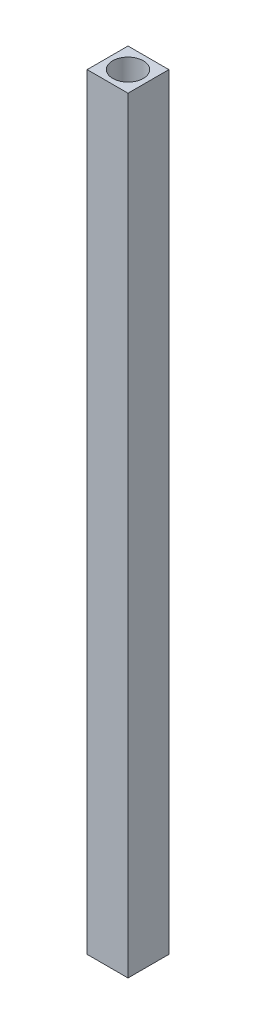
ISO-10303-21;
HEADER;
FILE_DESCRIPTION(('STEP AP214'),'2;1');
FILE_NAME('part.step','',(''),(''),'','','');
FILE_SCHEMA(('AUTOMOTIVE_DESIGN { 1 0 10303 214 1 1 1 1 }'));
ENDSEC;
DATA;
#1=APPLICATION_CONTEXT('core data for automotive mechanical design processes');
#2=APPLICATION_PROTOCOL_DEFINITION('international standard','automotive_design',2000,#1);
#3=PRODUCT_CONTEXT('',#1,'mechanical');
#4=PRODUCT('Part','Part','',(#3));
#5=PRODUCT_RELATED_PRODUCT_CATEGORY('part','',(#4));
#6=PRODUCT_DEFINITION_FORMATION('','',#4);
#7=PRODUCT_DEFINITION_CONTEXT('part definition',#1,'design');
#8=PRODUCT_DEFINITION('design','',#6,#7);
#9=PRODUCT_DEFINITION_SHAPE('','',#8);
#10=(LENGTH_UNIT() NAMED_UNIT(*) SI_UNIT(.MILLI.,.METRE.));
#11=(NAMED_UNIT(*) PLANE_ANGLE_UNIT() SI_UNIT($,.RADIAN.));
#12=(NAMED_UNIT(*) SI_UNIT($,.STERADIAN.) SOLID_ANGLE_UNIT());
#13=UNCERTAINTY_MEASURE_WITH_UNIT(LENGTH_MEASURE(1.E-05),#10,'distance_accuracy_value','');
#14=(GEOMETRIC_REPRESENTATION_CONTEXT(3) GLOBAL_UNCERTAINTY_ASSIGNED_CONTEXT((#13)) GLOBAL_UNIT_ASSIGNED_CONTEXT((#10,
#11,#12)) REPRESENTATION_CONTEXT('',''));
#15=CARTESIAN_POINT('',(0.,0.,0.));
#16=DIRECTION('',(0.,0.,1.));
#17=DIRECTION('',(1.,0.,0.));
#18=AXIS2_PLACEMENT_3D('',#15,#16,#17);
#19=CARTESIAN_POINT('',(0.,150.,0.));
#20=DIRECTION('',(0.,-1.,0.));
#21=DIRECTION('',(0.,0.,-1.));
#22=AXIS2_PLACEMENT_3D('',#19,#20,#21);
#23=PLANE('',#22);
#24=DIRECTION('',(0.,0.,-1.));
#25=VECTOR('',#24,1.);
#26=CARTESIAN_POINT('',(4.,150.,4.));
#27=LINE('',#26,#25);
#28=CARTESIAN_POINT('',(4.,150.,4.));
#29=VERTEX_POINT('',#28);
#30=CARTESIAN_POINT('',(4.,150.,-4.));
#31=VERTEX_POINT('',#30);
#32=EDGE_CURVE('E87',#29,#31,#27,.T.);
#33=ORIENTED_EDGE('',*,*,#32,.T.);
#34=DIRECTION('',(-1.,0.,0.));
#35=VECTOR('',#34,1.);
#36=CARTESIAN_POINT('',(-4.,150.,-4.));
#37=LINE('',#36,#35);
#38=CARTESIAN_POINT('',(-4.,150.,-4.));
#39=VERTEX_POINT('',#38);
#40=EDGE_CURVE('E82',#31,#39,#37,.T.);
#41=ORIENTED_EDGE('',*,*,#40,.T.);
#42=DIRECTION('',(0.,0.,1.));
#43=VECTOR('',#42,1.);
#44=CARTESIAN_POINT('',(-4.,150.,4.));
#45=LINE('',#44,#43);
#46=CARTESIAN_POINT('',(-4.,150.,4.));
#47=VERTEX_POINT('',#46);
#48=EDGE_CURVE('E85',#39,#47,#45,.T.);
#49=ORIENTED_EDGE('',*,*,#48,.T.);
#50=DIRECTION('',(1.,0.,0.));
#51=VECTOR('',#50,1.);
#52=CARTESIAN_POINT('',(-4.,150.,4.));
#53=LINE('',#52,#51);
#54=EDGE_CURVE('E52',#47,#29,#53,.T.);
#55=ORIENTED_EDGE('',*,*,#54,.T.);
#56=EDGE_LOOP('',(#33,#41,#49,#55));
#57=FACE_BOUND('',#56,.T.);
#58=CARTESIAN_POINT('',(0.,150.,0.));
#59=DIRECTION('',(0.,1.,0.));
#60=DIRECTION('',(0.,0.,1.));
#61=AXIS2_PLACEMENT_3D('',#58,#59,#60);
#62=CIRCLE('',#61,3.);
#63=CARTESIAN_POINT('',(0.,150.,3.));
#64=VERTEX_POINT('',#63);
#65=EDGE_CURVE('E102',#64,#64,#62,.T.);
#66=ORIENTED_EDGE('',*,*,#65,.F.);
#67=EDGE_LOOP('',(#66));
#68=FACE_BOUND('',#67,.T.);
#69=ADVANCED_FACE('F35',(#57,#68),#23,.F.);
#70=CARTESIAN_POINT('',(0.,0.,0.));
#71=DIRECTION('',(0.,-1.,0.));
#72=DIRECTION('',(0.,0.,-1.));
#73=AXIS2_PLACEMENT_3D('',#70,#71,#72);
#74=PLANE('',#73);
#75=DIRECTION('',(0.,0.,-1.));
#76=VECTOR('',#75,1.);
#77=CARTESIAN_POINT('',(4.,0.,4.));
#78=LINE('',#77,#76);
#79=CARTESIAN_POINT('',(4.,0.,4.));
#80=VERTEX_POINT('',#79);
#81=CARTESIAN_POINT('',(4.,0.,-4.));
#82=VERTEX_POINT('',#81);
#83=EDGE_CURVE('E99',#80,#82,#78,.T.);
#84=ORIENTED_EDGE('',*,*,#83,.F.);
#85=DIRECTION('',(1.,0.,0.));
#86=VECTOR('',#85,1.);
#87=CARTESIAN_POINT('',(-4.,0.,4.));
#88=LINE('',#87,#86);
#89=CARTESIAN_POINT('',(-4.,0.,4.));
#90=VERTEX_POINT('',#89);
#91=EDGE_CURVE('E75',#90,#80,#88,.T.);
#92=ORIENTED_EDGE('',*,*,#91,.F.);
#93=DIRECTION('',(0.,0.,1.));
#94=VECTOR('',#93,1.);
#95=CARTESIAN_POINT('',(-4.,0.,4.));
#96=LINE('',#95,#94);
#97=CARTESIAN_POINT('',(-4.,0.,-4.));
#98=VERTEX_POINT('',#97);
#99=EDGE_CURVE('E69',#98,#90,#96,.T.);
#100=ORIENTED_EDGE('',*,*,#99,.F.);
#101=DIRECTION('',(-1.,0.,0.));
#102=VECTOR('',#101,1.);
#103=CARTESIAN_POINT('',(-4.,0.,-4.));
#104=LINE('',#103,#102);
#105=EDGE_CURVE('E91',#82,#98,#104,.T.);
#106=ORIENTED_EDGE('',*,*,#105,.F.);
#107=EDGE_LOOP('',(#84,#92,#100,#106));
#108=FACE_BOUND('',#107,.T.);
#109=CARTESIAN_POINT('',(0.,0.,0.));
#110=DIRECTION('',(0.,1.,0.));
#111=DIRECTION('',(0.,0.,1.));
#112=AXIS2_PLACEMENT_3D('',#109,#110,#111);
#113=CIRCLE('',#112,3.);
#114=CARTESIAN_POINT('',(0.,0.,3.));
#115=VERTEX_POINT('',#114);
#116=EDGE_CURVE('E114',#115,#115,#113,.T.);
#117=ORIENTED_EDGE('',*,*,#116,.T.);
#118=EDGE_LOOP('',(#117));
#119=FACE_BOUND('',#118,.T.);
#120=ADVANCED_FACE('F110',(#108,#119),#74,.T.);
#121=CARTESIAN_POINT('',(4.,150.,4.));
#122=DIRECTION('',(-1.,0.,0.));
#123=DIRECTION('',(0.,0.,1.));
#124=AXIS2_PLACEMENT_3D('',#121,#122,#123);
#125=PLANE('',#124);
#126=ORIENTED_EDGE('',*,*,#83,.T.);
#127=DIRECTION('',(0.,-1.,0.));
#128=VECTOR('',#127,1.);
#129=CARTESIAN_POINT('',(4.,150.,-4.));
#130=LINE('',#129,#128);
#131=EDGE_CURVE('E11',#31,#82,#130,.T.);
#132=ORIENTED_EDGE('',*,*,#131,.F.);
#133=ORIENTED_EDGE('',*,*,#32,.F.);
#134=DIRECTION('',(0.,-1.,0.));
#135=VECTOR('',#134,1.);
#136=CARTESIAN_POINT('',(4.,150.,4.));
#137=LINE('',#136,#135);
#138=EDGE_CURVE('E95',#29,#80,#137,.T.);
#139=ORIENTED_EDGE('',*,*,#138,.T.);
#140=EDGE_LOOP('',(#126,#132,#133,#139));
#141=FACE_BOUND('',#140,.T.);
#142=ADVANCED_FACE('F37',(#141),#125,.F.);
#143=CARTESIAN_POINT('',(-4.,150.,-4.));
#144=DIRECTION('',(0.,0.,1.));
#145=DIRECTION('',(1.,0.,0.));
#146=AXIS2_PLACEMENT_3D('',#143,#144,#145);
#147=PLANE('',#146);
#148=ORIENTED_EDGE('',*,*,#105,.T.);
#149=DIRECTION('',(0.,-1.,0.));
#150=VECTOR('',#149,1.);
#151=CARTESIAN_POINT('',(-4.,150.,-4.));
#152=LINE('',#151,#150);
#153=EDGE_CURVE('E44',#39,#98,#152,.T.);
#154=ORIENTED_EDGE('',*,*,#153,.F.);
#155=ORIENTED_EDGE('',*,*,#40,.F.);
#156=ORIENTED_EDGE('',*,*,#131,.T.);
#157=EDGE_LOOP('',(#148,#154,#155,#156));
#158=FACE_BOUND('',#157,.T.);
#159=ADVANCED_FACE('F90',(#158),#147,.F.);
#160=CARTESIAN_POINT('',(-4.,150.,4.));
#161=DIRECTION('',(1.,0.,0.));
#162=DIRECTION('',(0.,0.,-1.));
#163=AXIS2_PLACEMENT_3D('',#160,#161,#162);
#164=PLANE('',#163);
#165=ORIENTED_EDGE('',*,*,#99,.T.);
#166=DIRECTION('',(0.,-1.,0.));
#167=VECTOR('',#166,1.);
#168=CARTESIAN_POINT('',(-4.,150.,4.));
#169=LINE('',#168,#167);
#170=EDGE_CURVE('E92',#47,#90,#169,.T.);
#171=ORIENTED_EDGE('',*,*,#170,.F.);
#172=ORIENTED_EDGE('',*,*,#48,.F.);
#173=ORIENTED_EDGE('',*,*,#153,.T.);
#174=EDGE_LOOP('',(#165,#171,#172,#173));
#175=FACE_BOUND('',#174,.T.);
#176=ADVANCED_FACE('F93',(#175),#164,.F.);
#177=CARTESIAN_POINT('',(-4.,150.,4.));
#178=DIRECTION('',(0.,0.,-1.));
#179=DIRECTION('',(-1.,0.,0.));
#180=AXIS2_PLACEMENT_3D('',#177,#178,#179);
#181=PLANE('',#180);
#182=ORIENTED_EDGE('',*,*,#91,.T.);
#183=ORIENTED_EDGE('',*,*,#138,.F.);
#184=ORIENTED_EDGE('',*,*,#54,.F.);
#185=ORIENTED_EDGE('',*,*,#170,.T.);
#186=EDGE_LOOP('',(#182,#183,#184,#185));
#187=FACE_BOUND('',#186,.T.);
#188=ADVANCED_FACE('F107',(#187),#181,.F.);
#189=CARTESIAN_POINT('',(0.,150.,0.));
#190=DIRECTION('',(0.,-1.,0.));
#191=DIRECTION('',(0.,0.,-1.));
#192=AXIS2_PLACEMENT_3D('',#189,#190,#191);
#193=CYLINDRICAL_SURFACE('',#192,3.);
#194=ORIENTED_EDGE('',*,*,#65,.T.);
#195=EDGE_LOOP('',(#194));
#196=FACE_BOUND('',#195,.T.);
#197=ORIENTED_EDGE('',*,*,#116,.F.);
#198=EDGE_LOOP('',(#197));
#199=FACE_BOUND('',#198,.T.);
#200=ADVANCED_FACE('F120',(#196,#199),#193,.F.);
#201=CLOSED_SHELL('',(#69,#120,#142,#159,#176,#188,#200));
#202=MANIFOLD_SOLID_BREP('B2',#201);
#203=ADVANCED_BREP_SHAPE_REPRESENTATION('',(#18,#202),#14);
#204=SHAPE_DEFINITION_REPRESENTATION(#9,#203);
ENDSEC;
END-ISO-10303-21;
